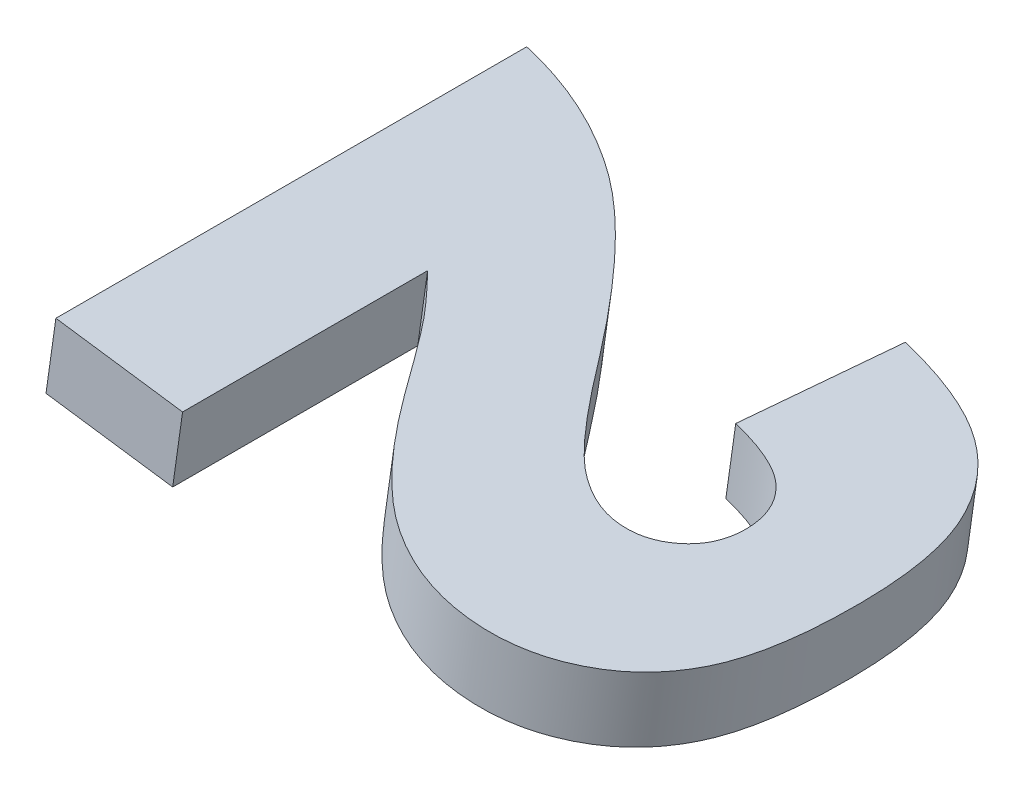
ISO-10303-21;
HEADER;
FILE_DESCRIPTION(('STEP AP214'),'2;1');
FILE_NAME('part.step','',(''),(''),'','','');
FILE_SCHEMA(('AUTOMOTIVE_DESIGN { 1 0 10303 214 1 1 1 1 }'));
ENDSEC;
DATA;
#1=APPLICATION_CONTEXT('core data for automotive mechanical design processes');
#2=APPLICATION_PROTOCOL_DEFINITION('international standard','automotive_design',2000,#1);
#3=PRODUCT_CONTEXT('',#1,'mechanical');
#4=PRODUCT('Part','Part','',(#3));
#5=PRODUCT_RELATED_PRODUCT_CATEGORY('part','',(#4));
#6=PRODUCT_DEFINITION_FORMATION('','',#4);
#7=PRODUCT_DEFINITION_CONTEXT('part definition',#1,'design');
#8=PRODUCT_DEFINITION('design','',#6,#7);
#9=PRODUCT_DEFINITION_SHAPE('','',#8);
#10=(LENGTH_UNIT() NAMED_UNIT(*) SI_UNIT(.MILLI.,.METRE.));
#11=(NAMED_UNIT(*) PLANE_ANGLE_UNIT() SI_UNIT($,.RADIAN.));
#12=(NAMED_UNIT(*) SI_UNIT($,.STERADIAN.) SOLID_ANGLE_UNIT());
#13=UNCERTAINTY_MEASURE_WITH_UNIT(LENGTH_MEASURE(1.E-05),#10,'distance_accuracy_value','');
#14=(GEOMETRIC_REPRESENTATION_CONTEXT(3) GLOBAL_UNCERTAINTY_ASSIGNED_CONTEXT((#13)) GLOBAL_UNIT_ASSIGNED_CONTEXT((#10,
#11,#12)) REPRESENTATION_CONTEXT('',''));
#15=CARTESIAN_POINT('',(0.,0.,0.));
#16=DIRECTION('',(0.,0.,1.));
#17=DIRECTION('',(1.,0.,0.));
#18=AXIS2_PLACEMENT_3D('',#15,#16,#17);
#19=CARTESIAN_POINT('',(804.569517718445,623.281669912127,2504.65594345795));
#20=DIRECTION('',(-0.990268068741567,0.139173100960088,0.));
#21=DIRECTION('',(0.000106014336863802,0.000754331202662766,0.999999709872657));
#22=AXIS2_PLACEMENT_3D('',#19,#20,#21);
#23=PLANE('',#22);
#24=CARTESIAN_POINT('',(803.177787112623,613.37899209775,2504.66356090242));
#25=CARTESIAN_POINT('',(803.174252337189,613.353840863653,2471.32114219944));
#26=CARTESIAN_POINT('',(803.170717561755,613.328689629556,2437.97872349646));
#27=B_SPLINE_CURVE_WITH_KNOTS('',2,(#24,#25,#26),.UNSPECIFIED.,.F.,.F.,(3,3),(0.,1.),.UNSPECIFIED.);
#28=CARTESIAN_POINT('',(803.177787112623,613.37899209775,2504.66356090242));
#29=VERTEX_POINT('',#28);
#30=CARTESIAN_POINT('',(803.170717561755,613.328689629556,2437.97872349646));
#31=VERTEX_POINT('',#30);
#32=EDGE_CURVE('E111',#29,#31,#27,.T.);
#33=ORIENTED_EDGE('',*,*,#32,.F.);
#34=DIRECTION('',(-0.139173060582166,-0.990267781437723,0.000761744447259926));
#35=VECTOR('',#34,1.);
#36=CARTESIAN_POINT('',(804.569517718445,623.281669912127,2504.65594345795));
#37=LINE('',#36,#35);
#38=CARTESIAN_POINT('',(804.569517718445,623.281669912127,2504.65594345795));
#39=VERTEX_POINT('',#38);
#40=EDGE_CURVE('E33',#39,#29,#37,.T.);
#41=ORIENTED_EDGE('',*,*,#40,.F.);
#42=CARTESIAN_POINT('',(804.569517718445,623.281669912127,2504.65594345795));
#43=CARTESIAN_POINT('',(804.565982943011,623.25651867803,2471.31352475496));
#44=CARTESIAN_POINT('',(804.562448167577,623.231367443933,2437.97110605198));
#45=B_SPLINE_CURVE_WITH_KNOTS('',2,(#42,#43,#44),.UNSPECIFIED.,.F.,.F.,(3,3),(0.,1.),.UNSPECIFIED.);
#46=CARTESIAN_POINT('',(804.562448167577,623.231367443933,2437.97110605198));
#47=VERTEX_POINT('',#46);
#48=EDGE_CURVE('E155',#39,#47,#45,.T.);
#49=ORIENTED_EDGE('',*,*,#48,.T.);
#50=DIRECTION('',(-0.139173060582166,-0.990267781437723,0.000761744447259926));
#51=VECTOR('',#50,1.);
#52=CARTESIAN_POINT('',(804.562448167577,623.231367443933,2437.97110605198));
#53=LINE('',#52,#51);
#54=EDGE_CURVE('E11',#47,#31,#53,.T.);
#55=ORIENTED_EDGE('',*,*,#54,.T.);
#56=EDGE_LOOP('',(#33,#41,#49,#55));
#57=FACE_BOUND('',#56,.T.);
#58=ADVANCED_FACE('F17',(#57),#23,.T.);
#59=CARTESIAN_POINT('',(804.562448167577,623.231367443933,2437.97110605198));
#60=CARTESIAN_POINT('',(814.343662178125,621.857588981804,2439.11708116288));
#61=CARTESIAN_POINT('',(822.963528344082,620.650616358063,2444.92881208247));
#62=CARTESIAN_POINT('',(831.583394510039,619.443643734322,2450.74054300206));
#63=CARTESIAN_POINT('',(843.320899784995,617.806338877614,2466.7226545481));
#64=CARTESIAN_POINT('',(850.499839957599,616.804923897576,2476.49769787572));
#65=CARTESIAN_POINT('',(854.228832997709,616.282946958634,2479.22621004455));
#66=CARTESIAN_POINT('',(857.957826037819,615.760970019692,2481.95472221337));
#67=CARTESIAN_POINT('',(861.308255520055,615.290097863647,2481.95472221337));
#68=CARTESIAN_POINT('',(864.928880928278,614.78125214663,2481.95472221337));
#69=CARTESIAN_POINT('',(867.495455856275,614.418465696964,2479.25349516624));
#70=CARTESIAN_POINT('',(870.062030784272,614.055679247298,2476.5522681191));
#71=CARTESIAN_POINT('',(870.061596892034,614.052591943603,2472.45949986587));
#72=CARTESIAN_POINT('',(870.061145644107,614.049381147761,2468.20302088251));
#73=CARTESIAN_POINT('',(867.412939200559,614.419484424842,2465.50179383538));
#74=CARTESIAN_POINT('',(864.764732757011,614.789587701923,2462.80056678824));
#75=CARTESIAN_POINT('',(858.063775443632,615.730632225176,2461.87287265084));
#76=B_SPLINE_CURVE_WITH_KNOTS('',2,(#59,#60,#61,#62,#63,#64,#65,#66,#67,#68,#69,#70,#71,#72,#73,
#74,#75),.UNSPECIFIED.,.F.,.F.,(3,2,2,2,2,2,2,2,3),(1.,2.,3.,4.,5.,6.,7.,8.,9.),.UNSPECIFIED.);
#77=DIRECTION('',(-0.139173060582166,-0.990267781437723,0.000761744447259926));
#78=VECTOR('',#77,1.);
#79=SURFACE_OF_LINEAR_EXTRUSION('',#76,#78);
#80=CARTESIAN_POINT('',(803.170717561755,613.328689629556,2437.97872349646));
#81=CARTESIAN_POINT('',(812.951931572304,611.954911167426,2439.12469860736));
#82=CARTESIAN_POINT('',(821.57179773826,610.747938543686,2444.93642952694));
#83=CARTESIAN_POINT('',(830.191663904217,609.540965919945,2450.74816044653));
#84=CARTESIAN_POINT('',(841.929169179174,607.903661063237,2466.73027199257));
#85=CARTESIAN_POINT('',(849.108109351778,606.902246083199,2476.5053153202));
#86=CARTESIAN_POINT('',(852.837102391888,606.380269144256,2479.23382748902));
#87=CARTESIAN_POINT('',(856.566095431997,605.858292205314,2481.96233965784));
#88=CARTESIAN_POINT('',(859.916524914234,605.387420049269,2481.96233965784));
#89=CARTESIAN_POINT('',(863.537150322456,604.878574332253,2481.96233965784));
#90=CARTESIAN_POINT('',(866.103725250454,604.515787882587,2479.2611126107));
#91=CARTESIAN_POINT('',(868.670300178451,604.15300143292,2476.55988556357));
#92=CARTESIAN_POINT('',(868.669866286213,604.149914129226,2472.46711731035));
#93=CARTESIAN_POINT('',(868.669415038285,604.146703333384,2468.21063832699));
#94=CARTESIAN_POINT('',(866.021208594737,604.516806610465,2465.50941127985));
#95=CARTESIAN_POINT('',(863.373002151189,604.886909887546,2462.80818423272));
#96=CARTESIAN_POINT('',(856.67204483781,605.827954410799,2461.88049009532));
#97=B_SPLINE_CURVE_WITH_KNOTS('',2,(#80,#81,#82,#83,#84,#85,#86,#87,#88,#89,#90,#91,#92,#93,#94,
#95,#96),.UNSPECIFIED.,.F.,.F.,(3,2,2,2,2,2,2,2,3),(1.,2.,3.,4.,5.,6.,7.,8.,9.),.UNSPECIFIED.);
#98=CARTESIAN_POINT('',(856.67204483781,605.827954410799,2461.88049009532));
#99=VERTEX_POINT('',#98);
#100=EDGE_CURVE('E119',#31,#99,#97,.T.);
#101=ORIENTED_EDGE('',*,*,#100,.F.);
#102=ORIENTED_EDGE('',*,*,#54,.F.);
#103=CARTESIAN_POINT('',(858.063775443632,615.730632225176,2461.87287265084));
#104=VERTEX_POINT('',#103);
#105=EDGE_CURVE('E163',#47,#104,#76,.T.);
#106=ORIENTED_EDGE('',*,*,#105,.T.);
#107=DIRECTION('',(-0.139173060582166,-0.990267781437723,0.000761744447259926));
#108=VECTOR('',#107,1.);
#109=CARTESIAN_POINT('',(858.063775443632,615.730632225176,2461.87287265084));
#110=LINE('',#109,#108);
#111=EDGE_CURVE('E25',#104,#99,#110,.T.);
#112=ORIENTED_EDGE('',*,*,#111,.T.);
#113=EDGE_LOOP('',(#101,#102,#106,#112));
#114=FACE_BOUND('',#113,.T.);
#115=ADVANCED_FACE('F162',(#114),#79,.T.);
#116=CARTESIAN_POINT('',(858.063775443632,615.730632225176,2461.87287265084));
#117=DIRECTION('',(-0.987053277544699,0.138659276863244,-0.0806190562338));
#118=DIRECTION('',(-0.0797288310240366,0.0119718831506231,0.996744695254191));
#119=AXIS2_PLACEMENT_3D('',#116,#117,#118);
#120=PLANE('',#119);
#121=CARTESIAN_POINT('',(856.67204483781,605.827954410799,2461.88049009532));
#122=CARTESIAN_POINT('',(857.562511206678,605.694244193545,2450.74816044653));
#123=CARTESIAN_POINT('',(858.452977575547,605.56053397629,2439.61583079775));
#124=B_SPLINE_CURVE_WITH_KNOTS('',2,(#121,#122,#123),.UNSPECIFIED.,.F.,.F.,(3,3),(9.,10.),.UNSPECIFIED.);
#125=CARTESIAN_POINT('',(858.452977575547,605.56053397629,2439.61583079775));
#126=VERTEX_POINT('',#125);
#127=EDGE_CURVE('E127',#99,#126,#124,.T.);
#128=ORIENTED_EDGE('',*,*,#127,.F.);
#129=ORIENTED_EDGE('',*,*,#111,.F.);
#130=CARTESIAN_POINT('',(858.063775443632,615.730632225176,2461.87287265084));
#131=CARTESIAN_POINT('',(858.9542418125,615.596922007922,2450.74054300206));
#132=CARTESIAN_POINT('',(859.844708181369,615.463211790667,2439.60821335328));
#133=B_SPLINE_CURVE_WITH_KNOTS('',2,(#130,#131,#132),.UNSPECIFIED.,.F.,.F.,(3,3),(9.,10.),.UNSPECIFIED.);
#134=CARTESIAN_POINT('',(859.844708181369,615.463211790667,2439.60821335328));
#135=VERTEX_POINT('',#134);
#136=EDGE_CURVE('E92',#104,#135,#133,.T.);
#137=ORIENTED_EDGE('',*,*,#136,.T.);
#138=DIRECTION('',(-0.139173060582166,-0.990267781437723,0.000761744447259926));
#139=VECTOR('',#138,1.);
#140=CARTESIAN_POINT('',(859.844708181369,615.463211790667,2439.60821335328));
#141=LINE('',#140,#139);
#142=EDGE_CURVE('E84',#135,#126,#141,.T.);
#143=ORIENTED_EDGE('',*,*,#142,.T.);
#144=EDGE_LOOP('',(#128,#129,#137,#143));
#145=FACE_BOUND('',#144,.T.);
#146=ADVANCED_FACE('F165',(#145),#120,.T.);
#147=CARTESIAN_POINT('',(859.844708181369,615.463211790667,2439.60821335328));
#148=CARTESIAN_POINT('',(869.13958688083,614.157909230434,2440.9178991943));
#149=CARTESIAN_POINT('',(874.354738507085,613.427654002839,2444.4103947704));
#150=CARTESIAN_POINT('',(879.56989013334,612.697398775244,2447.90289034649));
#151=CARTESIAN_POINT('',(882.353582150281,612.311066708978,2454.26032369984));
#152=CARTESIAN_POINT('',(885.137274167221,611.924734642711,2460.61775705319));
#153=CARTESIAN_POINT('',(885.138465924569,611.933214436858,2471.85922718873));
#154=CARTESIAN_POINT('',(885.139709748985,611.942064707449,2483.59182951466));
#155=CARTESIAN_POINT('',(882.49248100928,612.319124708855,2490.11297359814));
#156=CARTESIAN_POINT('',(879.845252269576,612.696184710261,2496.63411768162));
#157=CARTESIAN_POINT('',(874.360671260289,613.469867735354,2500.3721793529));
#158=CARTESIAN_POINT('',(868.876090251001,614.243550760447,2504.11024102419));
#159=CARTESIAN_POINT('',(862.067152916134,615.200484496926,2504.11024102419));
#160=CARTESIAN_POINT('',(854.825902099688,616.218175930959,2504.11024102419));
#161=CARTESIAN_POINT('',(848.232667365068,617.141499440793,2499.82647691914));
#162=CARTESIAN_POINT('',(841.639432630448,618.064822950628,2495.54271281409));
#163=CARTESIAN_POINT('',(833.788405759856,619.159501865593,2484.21847170538));
#164=CARTESIAN_POINT('',(829.15447172401,619.80561733125,2477.53453249987));
#165=CARTESIAN_POINT('',(827.316899340262,620.062129237811,2475.26986739976));
#166=CARTESIAN_POINT('',(825.479326956513,620.318641144373,2473.00520229964));
#167=CARTESIAN_POINT('',(822.506847797787,620.734045128299,2469.94926867055));
#168=B_SPLINE_CURVE_WITH_KNOTS('',2,(#147,#148,#149,#150,#151,#152,#153,#154,#155,#156,#157,
#158,#159,#160,#161,#162,#163,#164,#165,#166,#167),.UNSPECIFIED.,.F.,.F.,(3,2,2,2,2,2,2,2,2,2,
3),(10.,11.,12.,13.,14.,15.,16.,17.,18.,19.,20.),.UNSPECIFIED.);
#169=DIRECTION('',(-0.139173060582166,-0.990267781437723,0.000761744447259926));
#170=VECTOR('',#169,1.);
#171=SURFACE_OF_LINEAR_EXTRUSION('',#168,#170);
#172=CARTESIAN_POINT('',(858.452977575547,605.56053397629,2439.61583079775));
#173=CARTESIAN_POINT('',(867.747856275009,604.255231416057,2440.92551663878));
#174=CARTESIAN_POINT('',(872.963007901264,603.524976188462,2444.41801221487));
#175=CARTESIAN_POINT('',(878.178159527518,602.794720960867,2447.91050779096));
#176=CARTESIAN_POINT('',(880.961851544459,602.408388894601,2454.26794114431));
#177=CARTESIAN_POINT('',(883.745543561399,602.022056828334,2460.62537449766));
#178=CARTESIAN_POINT('',(883.746735318747,602.030536622481,2471.8668446332));
#179=CARTESIAN_POINT('',(883.747979143163,602.039386893072,2483.59944695913));
#180=CARTESIAN_POINT('',(881.100750403459,602.416446894478,2490.12059104261));
#181=CARTESIAN_POINT('',(878.453521663754,602.793506895884,2496.64173512609));
#182=CARTESIAN_POINT('',(872.968940654467,603.567189920977,2500.37979679738));
#183=CARTESIAN_POINT('',(867.484359645179,604.34087294607,2504.11785846866));
#184=CARTESIAN_POINT('',(860.675422310312,605.297806682549,2504.11785846866));
#185=CARTESIAN_POINT('',(853.434171493867,606.315498116581,2504.11785846866));
#186=CARTESIAN_POINT('',(846.840936759246,607.238821626416,2499.83409436361));
#187=CARTESIAN_POINT('',(840.247702024626,608.162145136251,2495.55033025857));
#188=CARTESIAN_POINT('',(832.396675154034,609.256824051216,2484.22608914985));
#189=CARTESIAN_POINT('',(827.762741118189,609.902939516873,2477.54214994435));
#190=CARTESIAN_POINT('',(825.92516873444,610.159451423434,2475.27748484423));
#191=CARTESIAN_POINT('',(824.087596350692,610.415963329995,2473.01281974411));
#192=CARTESIAN_POINT('',(821.115117191966,610.831367313922,2469.95688611503));
#193=B_SPLINE_CURVE_WITH_KNOTS('',2,(#172,#173,#174,#175,#176,#177,#178,#179,#180,#181,#182,
#183,#184,#185,#186,#187,#188,#189,#190,#191,#192),.UNSPECIFIED.,.F.,.F.,(3,2,2,2,2,2,2,2,2,2,
3),(10.,11.,12.,13.,14.,15.,16.,17.,18.,19.,20.),.UNSPECIFIED.);
#194=CARTESIAN_POINT('',(821.115117191966,610.831367313922,2469.95688611503));
#195=VERTEX_POINT('',#194);
#196=EDGE_CURVE('E135',#126,#195,#193,.T.);
#197=ORIENTED_EDGE('',*,*,#196,.F.);
#198=ORIENTED_EDGE('',*,*,#142,.F.);
#199=CARTESIAN_POINT('',(822.506847797787,620.734045128299,2469.94926867055));
#200=VERTEX_POINT('',#199);
#201=EDGE_CURVE('E87',#135,#200,#168,.T.);
#202=ORIENTED_EDGE('',*,*,#201,.T.);
#203=DIRECTION('',(-0.139173060582166,-0.990267781437723,0.000761744447259926));
#204=VECTOR('',#203,1.);
#205=CARTESIAN_POINT('',(822.506847797787,620.734045128299,2469.94926867055));
#206=LINE('',#205,#204);
#207=EDGE_CURVE('E73',#200,#195,#206,.T.);
#208=ORIENTED_EDGE('',*,*,#207,.T.);
#209=EDGE_LOOP('',(#197,#198,#202,#208));
#210=FACE_BOUND('',#209,.T.);
#211=ADVANCED_FACE('F88',(#210),#171,.T.);
#212=CARTESIAN_POINT('',(822.506847797787,620.734045128299,2469.94926867055));
#213=DIRECTION('',(0.990268068741567,-0.139173100960088,0.));
#214=DIRECTION('',(-0.000106014336862859,-0.00075433120266289,-0.999999709872657));
#215=AXIS2_PLACEMENT_3D('',#212,#213,#214);
#216=PLANE('',#215);
#217=CARTESIAN_POINT('',(821.115117191966,610.831367313922,2469.95688611503));
#218=CARTESIAN_POINT('',(821.116956895056,610.844457481586,2487.31022350872));
#219=CARTESIAN_POINT('',(821.118796598146,610.85754764925,2504.66356090242));
#220=B_SPLINE_CURVE_WITH_KNOTS('',2,(#217,#218,#219),.UNSPECIFIED.,.F.,.F.,(3,3),(20.,21.),.UNSPECIFIED.);
#221=CARTESIAN_POINT('',(821.118796598146,610.85754764925,2504.66356090242));
#222=VERTEX_POINT('',#221);
#223=EDGE_CURVE('E80',#195,#222,#220,.T.);
#224=ORIENTED_EDGE('',*,*,#223,.F.);
#225=ORIENTED_EDGE('',*,*,#207,.F.);
#226=CARTESIAN_POINT('',(822.506847797787,620.734045128299,2469.94926867055));
#227=CARTESIAN_POINT('',(822.508687500877,620.747135295964,2487.30260606426));
#228=CARTESIAN_POINT('',(822.510527203967,620.760225463628,2504.65594345795));
#229=B_SPLINE_CURVE_WITH_KNOTS('',2,(#226,#227,#228),.UNSPECIFIED.,.F.,.F.,(3,3),(20.,21.),.UNSPECIFIED.);
#230=CARTESIAN_POINT('',(822.510527203967,620.760225463628,2504.65594345795));
#231=VERTEX_POINT('',#230);
#232=EDGE_CURVE('E77',#200,#231,#229,.T.);
#233=ORIENTED_EDGE('',*,*,#232,.T.);
#234=DIRECTION('',(-0.139173060582166,-0.990267781437723,0.000761744447259926));
#235=VECTOR('',#234,1.);
#236=CARTESIAN_POINT('',(822.510527203967,620.760225463628,2504.65594345795));
#237=LINE('',#236,#235);
#238=EDGE_CURVE('E55',#231,#222,#237,.T.);
#239=ORIENTED_EDGE('',*,*,#238,.T.);
#240=EDGE_LOOP('',(#224,#225,#233,#239));
#241=FACE_BOUND('',#240,.T.);
#242=ADVANCED_FACE('F75',(#241),#216,.T.);
#243=CARTESIAN_POINT('',(822.510527203967,620.760225463628,2504.65594345795));
#244=DIRECTION('',(0.000106014336868465,0.000754331202662106,0.999999709872657));
#245=DIRECTION('',(0.990268068741567,-0.139173100960088,0.));
#246=AXIS2_PLACEMENT_3D('',#243,#244,#245);
#247=PLANE('',#246);
#248=CARTESIAN_POINT('',(821.118796598146,610.85754764925,2504.66356090242));
#249=CARTESIAN_POINT('',(812.148291855384,612.1182698735,2504.66356090242));
#250=CARTESIAN_POINT('',(803.177787112623,613.37899209775,2504.66356090242));
#251=B_SPLINE_CURVE_WITH_KNOTS('',2,(#248,#249,#250),.UNSPECIFIED.,.F.,.F.,(3,3),(21.,22.),.UNSPECIFIED.);
#252=EDGE_CURVE('E148',#222,#29,#251,.T.);
#253=ORIENTED_EDGE('',*,*,#252,.F.);
#254=ORIENTED_EDGE('',*,*,#238,.F.);
#255=CARTESIAN_POINT('',(822.510527203967,620.760225463628,2504.65594345795));
#256=CARTESIAN_POINT('',(813.540022461206,622.020947687877,2504.65594345795));
#257=CARTESIAN_POINT('',(804.569517718445,623.281669912127,2504.65594345795));
#258=B_SPLINE_CURVE_WITH_KNOTS('',2,(#255,#256,#257),.UNSPECIFIED.,.F.,.F.,(3,3),(21.,22.),.UNSPECIFIED.);
#259=EDGE_CURVE('E96',#231,#39,#258,.T.);
#260=ORIENTED_EDGE('',*,*,#259,.T.);
#261=ORIENTED_EDGE('',*,*,#40,.T.);
#262=EDGE_LOOP('',(#253,#254,#260,#261));
#263=FACE_BOUND('',#262,.T.);
#264=ADVANCED_FACE('F191',(#263),#247,.T.);
#265=CARTESIAN_POINT('',(861.308255520055,615.290097863647,2481.95472221337));
#266=DIRECTION('',(0.139173060582149,0.990267781437725,-0.000761744447216431));
#267=DIRECTION('',(0.286420824998843,-0.0409901500375138,-0.957226680889582));
#268=AXIS2_PLACEMENT_3D('',#265,#266,#267);
#269=PLANE('',#268);
#270=ORIENTED_EDGE('',*,*,#48,.F.);
#271=ORIENTED_EDGE('',*,*,#259,.F.);
#272=ORIENTED_EDGE('',*,*,#232,.F.);
#273=ORIENTED_EDGE('',*,*,#201,.F.);
#274=ORIENTED_EDGE('',*,*,#136,.F.);
#275=ORIENTED_EDGE('',*,*,#105,.F.);
#276=EDGE_LOOP('',(#270,#271,#272,#273,#274,#275));
#277=FACE_BOUND('',#276,.T.);
#278=ADVANCED_FACE('F95',(#277),#269,.T.);
#279=CARTESIAN_POINT('',(859.916524914234,605.387420049269,2481.96233965784));
#280=DIRECTION('',(0.139173060582149,0.990267781437725,-0.000761744447216431));
#281=DIRECTION('',(0.286420824998843,-0.0409901500375138,-0.957226680889582));
#282=AXIS2_PLACEMENT_3D('',#279,#280,#281);
#283=PLANE('',#282);
#284=ORIENTED_EDGE('',*,*,#32,.T.);
#285=ORIENTED_EDGE('',*,*,#100,.T.);
#286=ORIENTED_EDGE('',*,*,#127,.T.);
#287=ORIENTED_EDGE('',*,*,#196,.T.);
#288=ORIENTED_EDGE('',*,*,#223,.T.);
#289=ORIENTED_EDGE('',*,*,#252,.T.);
#290=EDGE_LOOP('',(#284,#285,#286,#287,#288,#289));
#291=FACE_BOUND('',#290,.T.);
#292=ADVANCED_FACE('F167',(#291),#283,.F.);
#293=CLOSED_SHELL('',(#58,#115,#146,#211,#242,#264,#278,#292));
#294=MANIFOLD_SOLID_BREP('B1',#293);
#295=ADVANCED_BREP_SHAPE_REPRESENTATION('',(#18,#294),#14);
#296=SHAPE_DEFINITION_REPRESENTATION(#9,#295);
ENDSEC;
END-ISO-10303-21;
